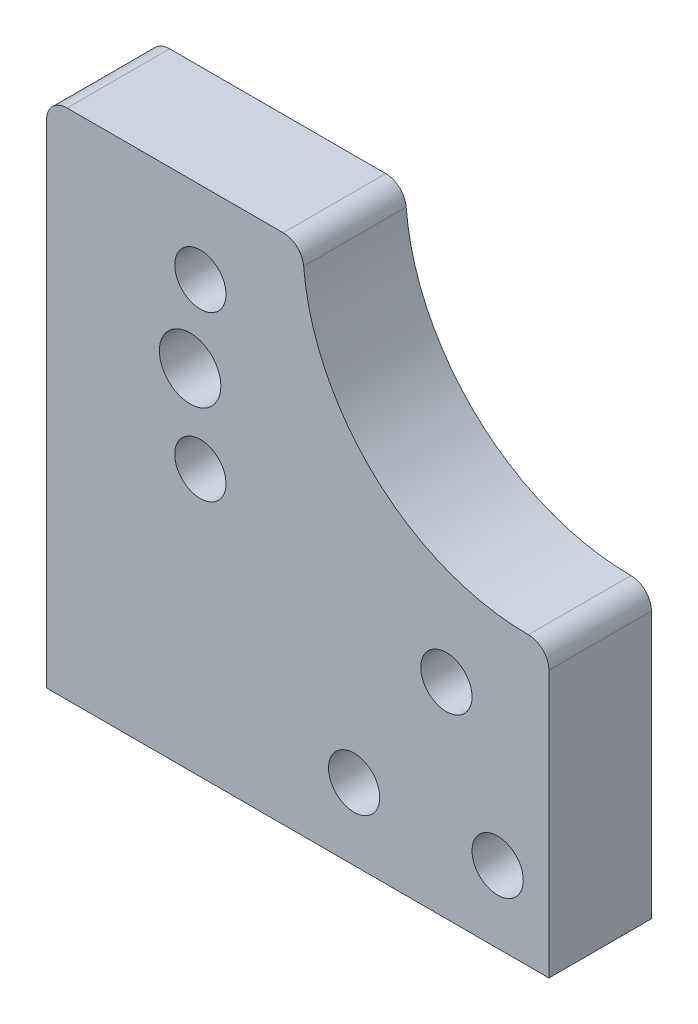
ISO-10303-21;
HEADER;
FILE_DESCRIPTION(('STEP AP214'),'2;1');
FILE_NAME('part.step','',(''),(''),'','','');
FILE_SCHEMA(('AUTOMOTIVE_DESIGN { 1 0 10303 214 1 1 1 1 }'));
ENDSEC;
DATA;
#1=APPLICATION_CONTEXT('core data for automotive mechanical design processes');
#2=APPLICATION_PROTOCOL_DEFINITION('international standard','automotive_design',2000,#1);
#3=PRODUCT_CONTEXT('',#1,'mechanical');
#4=PRODUCT('Part','Part','',(#3));
#5=PRODUCT_RELATED_PRODUCT_CATEGORY('part','',(#4));
#6=PRODUCT_DEFINITION_FORMATION('','',#4);
#7=PRODUCT_DEFINITION_CONTEXT('part definition',#1,'design');
#8=PRODUCT_DEFINITION('design','',#6,#7);
#9=PRODUCT_DEFINITION_SHAPE('','',#8);
#10=(LENGTH_UNIT() NAMED_UNIT(*) SI_UNIT(.MILLI.,.METRE.));
#11=(NAMED_UNIT(*) PLANE_ANGLE_UNIT() SI_UNIT($,.RADIAN.));
#12=(NAMED_UNIT(*) SI_UNIT($,.STERADIAN.) SOLID_ANGLE_UNIT());
#13=UNCERTAINTY_MEASURE_WITH_UNIT(LENGTH_MEASURE(1.E-05),#10,'distance_accuracy_value','');
#14=(GEOMETRIC_REPRESENTATION_CONTEXT(3) GLOBAL_UNCERTAINTY_ASSIGNED_CONTEXT((#13)) GLOBAL_UNIT_ASSIGNED_CONTEXT((#10,
#11,#12)) REPRESENTATION_CONTEXT('',''));
#15=CARTESIAN_POINT('',(0.,0.,0.));
#16=DIRECTION('',(0.,0.,1.));
#17=DIRECTION('',(1.,0.,0.));
#18=AXIS2_PLACEMENT_3D('',#15,#16,#17);
#19=CARTESIAN_POINT('',(8.99999999999999,25.,5.));
#20=DIRECTION('',(0.,0.,1.));
#21=DIRECTION('',(1.,0.,0.));
#22=AXIS2_PLACEMENT_3D('',#19,#20,#21);
#23=PLANE('',#22);
#24=CARTESIAN_POINT('',(-7.,13.,5.));
#25=DIRECTION('',(0.,0.,1.));
#26=DIRECTION('',(1.,0.,0.));
#27=AXIS2_PLACEMENT_3D('',#24,#25,#26);
#28=CIRCLE('',#27,1.25);
#29=CARTESIAN_POINT('',(-5.75,13.,5.));
#30=VERTEX_POINT('',#29);
#31=EDGE_CURVE('E134',#30,#30,#28,.T.);
#32=ORIENTED_EDGE('',*,*,#31,.F.);
#33=EDGE_LOOP('',(#32));
#34=FACE_BOUND('',#33,.T.);
#35=CARTESIAN_POINT('',(-7.,21.,5.));
#36=DIRECTION('',(0.,0.,1.));
#37=DIRECTION('',(1.,0.,0.));
#38=AXIS2_PLACEMENT_3D('',#35,#36,#37);
#39=CIRCLE('',#38,1.25);
#40=CARTESIAN_POINT('',(-5.75,21.,5.));
#41=VERTEX_POINT('',#40);
#42=EDGE_CURVE('E140',#41,#41,#39,.T.);
#43=ORIENTED_EDGE('',*,*,#42,.F.);
#44=EDGE_LOOP('',(#43));
#45=FACE_BOUND('',#44,.T.);
#46=CARTESIAN_POINT('',(5.,10.,5.));
#47=DIRECTION('',(0.,0.,1.));
#48=DIRECTION('',(1.,0.,0.));
#49=AXIS2_PLACEMENT_3D('',#46,#47,#48);
#50=CIRCLE('',#49,1.25);
#51=CARTESIAN_POINT('',(6.25,10.,5.));
#52=VERTEX_POINT('',#51);
#53=EDGE_CURVE('E146',#52,#52,#50,.T.);
#54=ORIENTED_EDGE('',*,*,#53,.F.);
#55=EDGE_LOOP('',(#54));
#56=FACE_BOUND('',#55,.T.);
#57=CARTESIAN_POINT('',(0.499999999999997,3.5,5.));
#58=DIRECTION('',(0.,0.,1.));
#59=DIRECTION('',(1.,0.,0.));
#60=AXIS2_PLACEMENT_3D('',#57,#58,#59);
#61=CIRCLE('',#60,1.25);
#62=CARTESIAN_POINT('',(1.75,3.5,5.));
#63=VERTEX_POINT('',#62);
#64=EDGE_CURVE('E152',#63,#63,#61,.T.);
#65=ORIENTED_EDGE('',*,*,#64,.F.);
#66=EDGE_LOOP('',(#65));
#67=FACE_BOUND('',#66,.T.);
#68=CARTESIAN_POINT('',(7.5,3.5,5.));
#69=DIRECTION('',(0.,0.,1.));
#70=DIRECTION('',(1.,0.,0.));
#71=AXIS2_PLACEMENT_3D('',#68,#69,#70);
#72=CIRCLE('',#71,1.25);
#73=CARTESIAN_POINT('',(8.75,3.5,5.));
#74=VERTEX_POINT('',#73);
#75=EDGE_CURVE('E158',#74,#74,#72,.T.);
#76=ORIENTED_EDGE('',*,*,#75,.F.);
#77=EDGE_LOOP('',(#76));
#78=FACE_BOUND('',#77,.T.);
#79=DIRECTION('',(-1.,0.,0.));
#80=VECTOR('',#79,1.);
#81=CARTESIAN_POINT('',(-14.5,25.,5.));
#82=LINE('',#81,#80);
#83=CARTESIAN_POINT('',(-2.9582607431014,25.,5.));
#84=VERTEX_POINT('',#83);
#85=CARTESIAN_POINT('',(-13.5,25.,5.));
#86=VERTEX_POINT('',#85);
#87=EDGE_CURVE('E171',#84,#86,#82,.T.);
#88=ORIENTED_EDGE('',*,*,#87,.T.);
#89=CARTESIAN_POINT('',(-13.5,24.,5.));
#90=DIRECTION('',(0.,0.,1.));
#91=DIRECTION('',(1.,0.,0.));
#92=AXIS2_PLACEMENT_3D('',#89,#90,#91);
#93=CIRCLE('',#92,1.);
#94=CARTESIAN_POINT('',(-14.5,24.,5.));
#95=VERTEX_POINT('',#94);
#96=EDGE_CURVE('E220',#86,#95,#93,.T.);
#97=ORIENTED_EDGE('',*,*,#96,.T.);
#98=DIRECTION('',(0.,-1.,0.));
#99=VECTOR('',#98,1.);
#100=CARTESIAN_POINT('',(-14.5,0.,5.));
#101=LINE('',#100,#99);
#102=CARTESIAN_POINT('',(-14.5,0.,5.));
#103=VERTEX_POINT('',#102);
#104=EDGE_CURVE('E174',#95,#103,#101,.T.);
#105=ORIENTED_EDGE('',*,*,#104,.T.);
#106=DIRECTION('',(1.,0.,0.));
#107=VECTOR('',#106,1.);
#108=CARTESIAN_POINT('',(-9.99999999999999,0.,5.));
#109=LINE('',#108,#107);
#110=CARTESIAN_POINT('',(9.99999999999999,0.,5.));
#111=VERTEX_POINT('',#110);
#112=EDGE_CURVE('E177',#103,#111,#109,.T.);
#113=ORIENTED_EDGE('',*,*,#112,.T.);
#114=DIRECTION('',(0.,1.,0.));
#115=VECTOR('',#114,1.);
#116=CARTESIAN_POINT('',(10.,0.499999999999998,5.));
#117=LINE('',#116,#115);
#118=CARTESIAN_POINT('',(10.0000000000002,13.,5.));
#119=VERTEX_POINT('',#118);
#120=EDGE_CURVE('E179',#111,#119,#117,.T.);
#121=ORIENTED_EDGE('',*,*,#120,.T.);
#122=CARTESIAN_POINT('',(9.,13.,5.));
#123=DIRECTION('',(0.,0.,1.));
#124=DIRECTION('',(1.,0.,0.));
#125=AXIS2_PLACEMENT_3D('',#122,#123,#124);
#126=CIRCLE('',#125,1.);
#127=CARTESIAN_POINT('',(8.99999999999998,14.,5.));
#128=VERTEX_POINT('',#127);
#129=EDGE_CURVE('E216',#119,#128,#126,.T.);
#130=ORIENTED_EDGE('',*,*,#129,.T.);
#131=CARTESIAN_POINT('',(8.99999999999999,25.,5.));
#132=DIRECTION('',(0.,0.,-1.));
#133=DIRECTION('',(1.,0.,0.));
#134=AXIS2_PLACEMENT_3D('',#131,#132,#133);
#135=CIRCLE('',#134,11.);
#136=CARTESIAN_POINT('',(-1.96173901450962,24.0833333333333,5.));
#137=VERTEX_POINT('',#136);
#138=EDGE_CURVE('E181',#128,#137,#135,.T.);
#139=ORIENTED_EDGE('',*,*,#138,.T.);
#140=CARTESIAN_POINT('',(-2.9582607431014,24.,5.));
#141=DIRECTION('',(0.,0.,1.));
#142=DIRECTION('',(1.,0.,0.));
#143=AXIS2_PLACEMENT_3D('',#140,#141,#142);
#144=CIRCLE('',#143,1.);
#145=EDGE_CURVE('E218',#137,#84,#144,.T.);
#146=ORIENTED_EDGE('',*,*,#145,.T.);
#147=EDGE_LOOP('',(#88,#97,#105,#113,#121,#130,#139,#146));
#148=FACE_BOUND('',#147,.T.);
#149=CARTESIAN_POINT('',(-7.5,17.,5.));
#150=DIRECTION('',(0.,0.,1.));
#151=DIRECTION('',(1.,0.,0.));
#152=AXIS2_PLACEMENT_3D('',#149,#150,#151);
#153=CIRCLE('',#152,1.5);
#154=CARTESIAN_POINT('',(-6.,17.,5.));
#155=VERTEX_POINT('',#154);
#156=EDGE_CURVE('E165',#155,#155,#153,.T.);
#157=ORIENTED_EDGE('',*,*,#156,.F.);
#158=EDGE_LOOP('',(#157));
#159=FACE_BOUND('',#158,.T.);
#160=ADVANCED_FACE('F43',(#34,#45,#56,#67,#78,#148,#159),#23,.T.);
#161=CARTESIAN_POINT('',(8.99999999999999,25.,0.));
#162=DIRECTION('',(0.,0.,1.));
#163=DIRECTION('',(1.,0.,0.));
#164=AXIS2_PLACEMENT_3D('',#161,#162,#163);
#165=PLANE('',#164);
#166=CARTESIAN_POINT('',(-7.,13.,0.));
#167=DIRECTION('',(0.,0.,1.));
#168=DIRECTION('',(1.,0.,0.));
#169=AXIS2_PLACEMENT_3D('',#166,#167,#168);
#170=CIRCLE('',#169,1.25);
#171=CARTESIAN_POINT('',(-5.75,13.,0.));
#172=VERTEX_POINT('',#171);
#173=EDGE_CURVE('E137',#172,#172,#170,.T.);
#174=ORIENTED_EDGE('',*,*,#173,.T.);
#175=EDGE_LOOP('',(#174));
#176=FACE_BOUND('',#175,.T.);
#177=CARTESIAN_POINT('',(-7.,21.,0.));
#178=DIRECTION('',(0.,0.,1.));
#179=DIRECTION('',(1.,0.,0.));
#180=AXIS2_PLACEMENT_3D('',#177,#178,#179);
#181=CIRCLE('',#180,1.25);
#182=CARTESIAN_POINT('',(-5.75,21.,0.));
#183=VERTEX_POINT('',#182);
#184=EDGE_CURVE('E143',#183,#183,#181,.T.);
#185=ORIENTED_EDGE('',*,*,#184,.T.);
#186=EDGE_LOOP('',(#185));
#187=FACE_BOUND('',#186,.T.);
#188=CARTESIAN_POINT('',(5.,10.,0.));
#189=DIRECTION('',(0.,0.,1.));
#190=DIRECTION('',(1.,0.,0.));
#191=AXIS2_PLACEMENT_3D('',#188,#189,#190);
#192=CIRCLE('',#191,1.25);
#193=CARTESIAN_POINT('',(6.25,10.,0.));
#194=VERTEX_POINT('',#193);
#195=EDGE_CURVE('E149',#194,#194,#192,.T.);
#196=ORIENTED_EDGE('',*,*,#195,.T.);
#197=EDGE_LOOP('',(#196));
#198=FACE_BOUND('',#197,.T.);
#199=CARTESIAN_POINT('',(0.499999999999997,3.5,0.));
#200=DIRECTION('',(0.,0.,1.));
#201=DIRECTION('',(1.,0.,0.));
#202=AXIS2_PLACEMENT_3D('',#199,#200,#201);
#203=CIRCLE('',#202,1.25);
#204=CARTESIAN_POINT('',(1.75,3.5,0.));
#205=VERTEX_POINT('',#204);
#206=EDGE_CURVE('E155',#205,#205,#203,.T.);
#207=ORIENTED_EDGE('',*,*,#206,.T.);
#208=EDGE_LOOP('',(#207));
#209=FACE_BOUND('',#208,.T.);
#210=CARTESIAN_POINT('',(7.5,3.5,0.));
#211=DIRECTION('',(0.,0.,1.));
#212=DIRECTION('',(1.,0.,0.));
#213=AXIS2_PLACEMENT_3D('',#210,#211,#212);
#214=CIRCLE('',#213,1.25);
#215=CARTESIAN_POINT('',(8.75,3.5,0.));
#216=VERTEX_POINT('',#215);
#217=EDGE_CURVE('E161',#216,#216,#214,.T.);
#218=ORIENTED_EDGE('',*,*,#217,.T.);
#219=EDGE_LOOP('',(#218));
#220=FACE_BOUND('',#219,.T.);
#221=DIRECTION('',(0.,-1.,0.));
#222=VECTOR('',#221,1.);
#223=CARTESIAN_POINT('',(-14.5,0.,0.));
#224=LINE('',#223,#222);
#225=CARTESIAN_POINT('',(-14.5,24.,0.));
#226=VERTEX_POINT('',#225);
#227=CARTESIAN_POINT('',(-14.5,0.,0.));
#228=VERTEX_POINT('',#227);
#229=EDGE_CURVE('E168',#226,#228,#224,.T.);
#230=ORIENTED_EDGE('',*,*,#229,.F.);
#231=CARTESIAN_POINT('',(-13.5,24.,0.));
#232=DIRECTION('',(0.,0.,1.));
#233=DIRECTION('',(1.,0.,0.));
#234=AXIS2_PLACEMENT_3D('',#231,#232,#233);
#235=CIRCLE('',#234,1.);
#236=CARTESIAN_POINT('',(-13.5,25.,0.));
#237=VERTEX_POINT('',#236);
#238=EDGE_CURVE('E209',#226,#237,#235,.F.);
#239=ORIENTED_EDGE('',*,*,#238,.T.);
#240=DIRECTION('',(-1.,0.,0.));
#241=VECTOR('',#240,1.);
#242=CARTESIAN_POINT('',(-10.,25.,0.));
#243=LINE('',#242,#241);
#244=CARTESIAN_POINT('',(-2.9582607431014,25.,0.));
#245=VERTEX_POINT('',#244);
#246=EDGE_CURVE('E175',#245,#237,#243,.T.);
#247=ORIENTED_EDGE('',*,*,#246,.F.);
#248=CARTESIAN_POINT('',(-2.9582607431014,24.,0.));
#249=DIRECTION('',(0.,0.,1.));
#250=DIRECTION('',(1.,0.,0.));
#251=AXIS2_PLACEMENT_3D('',#248,#249,#250);
#252=CIRCLE('',#251,1.);
#253=CARTESIAN_POINT('',(-1.96173901450962,24.0833333333333,0.));
#254=VERTEX_POINT('',#253);
#255=EDGE_CURVE('E207',#245,#254,#252,.F.);
#256=ORIENTED_EDGE('',*,*,#255,.T.);
#257=CARTESIAN_POINT('',(8.99999999999999,25.,0.));
#258=DIRECTION('',(0.,0.,-1.));
#259=DIRECTION('',(1.,0.,0.));
#260=AXIS2_PLACEMENT_3D('',#257,#258,#259);
#261=CIRCLE('',#260,11.);
#262=CARTESIAN_POINT('',(8.99999999999998,14.,0.));
#263=VERTEX_POINT('',#262);
#264=EDGE_CURVE('E190',#263,#254,#261,.T.);
#265=ORIENTED_EDGE('',*,*,#264,.F.);
#266=CARTESIAN_POINT('',(9.,13.,0.));
#267=DIRECTION('',(0.,0.,1.));
#268=DIRECTION('',(1.,0.,0.));
#269=AXIS2_PLACEMENT_3D('',#266,#267,#268);
#270=CIRCLE('',#269,1.);
#271=CARTESIAN_POINT('',(10.,13.,0.));
#272=VERTEX_POINT('',#271);
#273=EDGE_CURVE('E205',#263,#272,#270,.F.);
#274=ORIENTED_EDGE('',*,*,#273,.T.);
#275=DIRECTION('',(0.,1.,0.));
#276=VECTOR('',#275,1.);
#277=CARTESIAN_POINT('',(10.,14.,0.));
#278=LINE('',#277,#276);
#279=CARTESIAN_POINT('',(9.99999999999999,0.,0.));
#280=VERTEX_POINT('',#279);
#281=EDGE_CURVE('E188',#280,#272,#278,.T.);
#282=ORIENTED_EDGE('',*,*,#281,.F.);
#283=DIRECTION('',(1.,0.,0.));
#284=VECTOR('',#283,1.);
#285=CARTESIAN_POINT('',(9.99999999999999,0.,0.));
#286=LINE('',#285,#284);
#287=EDGE_CURVE('E185',#228,#280,#286,.T.);
#288=ORIENTED_EDGE('',*,*,#287,.F.);
#289=EDGE_LOOP('',(#230,#239,#247,#256,#265,#274,#282,#288));
#290=FACE_BOUND('',#289,.T.);
#291=CARTESIAN_POINT('',(-7.5,17.,0.));
#292=DIRECTION('',(0.,0.,1.));
#293=DIRECTION('',(1.,0.,0.));
#294=AXIS2_PLACEMENT_3D('',#291,#292,#293);
#295=CIRCLE('',#294,1.5);
#296=CARTESIAN_POINT('',(-6.,17.,0.));
#297=VERTEX_POINT('',#296);
#298=EDGE_CURVE('E164',#297,#297,#295,.T.);
#299=ORIENTED_EDGE('',*,*,#298,.T.);
#300=EDGE_LOOP('',(#299));
#301=FACE_BOUND('',#300,.T.);
#302=ADVANCED_FACE('F237',(#176,#187,#198,#209,#220,#290,#301),#165,.F.);
#303=CARTESIAN_POINT('',(-14.5,0.,5.));
#304=DIRECTION('',(1.,0.,0.));
#305=DIRECTION('',(0.,0.,-1.));
#306=AXIS2_PLACEMENT_3D('',#303,#304,#305);
#307=PLANE('',#306);
#308=ORIENTED_EDGE('',*,*,#104,.F.);
#309=DIRECTION('',(0.,0.,-1.));
#310=VECTOR('',#309,1.);
#311=CARTESIAN_POINT('',(-14.5,24.,5.));
#312=LINE('',#311,#310);
#313=EDGE_CURVE('E202',#95,#226,#312,.T.);
#314=ORIENTED_EDGE('',*,*,#313,.T.);
#315=ORIENTED_EDGE('',*,*,#229,.T.);
#316=DIRECTION('',(0.,0.,-1.));
#317=VECTOR('',#316,1.);
#318=CARTESIAN_POINT('',(-14.5,0.,5.));
#319=LINE('',#318,#317);
#320=EDGE_CURVE('E199',#103,#228,#319,.T.);
#321=ORIENTED_EDGE('',*,*,#320,.F.);
#322=EDGE_LOOP('',(#308,#314,#315,#321));
#323=FACE_BOUND('',#322,.T.);
#324=ADVANCED_FACE('F231',(#323),#307,.F.);
#325=CARTESIAN_POINT('',(9.99999999999999,0.,5.));
#326=DIRECTION('',(0.,1.,0.));
#327=DIRECTION('',(0.,0.,1.));
#328=AXIS2_PLACEMENT_3D('',#325,#326,#327);
#329=PLANE('',#328);
#330=CARTESIAN_POINT('',(-3.75,0.,2.5));
#331=DIRECTION('',(0.,-1.,0.));
#332=DIRECTION('',(0.,0.,-1.));
#333=AXIS2_PLACEMENT_3D('',#330,#331,#332);
#334=CIRCLE('',#333,1.24999999999999);
#335=CARTESIAN_POINT('',(-3.75,0.,1.25000000000001));
#336=VERTEX_POINT('',#335);
#337=EDGE_CURVE('E124',#336,#336,#334,.T.);
#338=ORIENTED_EDGE('',*,*,#337,.F.);
#339=EDGE_LOOP('',(#338));
#340=FACE_BOUND('',#339,.T.);
#341=CARTESIAN_POINT('',(-10.25,0.,2.5));
#342=DIRECTION('',(0.,-1.,0.));
#343=DIRECTION('',(0.,0.,-1.));
#344=AXIS2_PLACEMENT_3D('',#341,#342,#343);
#345=CIRCLE('',#344,1.24999999999999);
#346=CARTESIAN_POINT('',(-10.25,0.,1.25000000000001));
#347=VERTEX_POINT('',#346);
#348=EDGE_CURVE('E123',#347,#347,#345,.T.);
#349=ORIENTED_EDGE('',*,*,#348,.F.);
#350=EDGE_LOOP('',(#349));
#351=FACE_BOUND('',#350,.T.);
#352=ORIENTED_EDGE('',*,*,#287,.T.);
#353=DIRECTION('',(0.,0.,-1.));
#354=VECTOR('',#353,1.);
#355=CARTESIAN_POINT('',(9.99999999999999,0.,5.));
#356=LINE('',#355,#354);
#357=EDGE_CURVE('E196',#111,#280,#356,.T.);
#358=ORIENTED_EDGE('',*,*,#357,.F.);
#359=ORIENTED_EDGE('',*,*,#112,.F.);
#360=ORIENTED_EDGE('',*,*,#320,.T.);
#361=EDGE_LOOP('',(#352,#358,#359,#360));
#362=FACE_BOUND('',#361,.T.);
#363=ADVANCED_FACE('F254',(#340,#351,#362),#329,.F.);
#364=CARTESIAN_POINT('',(10.,14.,5.));
#365=DIRECTION('',(-1.,0.,0.));
#366=DIRECTION('',(0.,-1.,0.));
#367=AXIS2_PLACEMENT_3D('',#364,#365,#366);
#368=PLANE('',#367);
#369=ORIENTED_EDGE('',*,*,#281,.T.);
#370=DIRECTION('',(0.,0.,-1.));
#371=VECTOR('',#370,1.);
#372=CARTESIAN_POINT('',(10.,13.,5.));
#373=LINE('',#372,#371);
#374=EDGE_CURVE('E11',#272,#119,#373,.F.);
#375=ORIENTED_EDGE('',*,*,#374,.T.);
#376=ORIENTED_EDGE('',*,*,#120,.F.);
#377=ORIENTED_EDGE('',*,*,#357,.T.);
#378=EDGE_LOOP('',(#369,#375,#376,#377));
#379=FACE_BOUND('',#378,.T.);
#380=ADVANCED_FACE('F251',(#379),#368,.F.);
#381=CARTESIAN_POINT('',(8.99999999999999,25.,5.));
#382=DIRECTION('',(0.,0.,-1.));
#383=DIRECTION('',(-1.,0.,0.));
#384=AXIS2_PLACEMENT_3D('',#381,#382,#383);
#385=CYLINDRICAL_SURFACE('',#384,11.);
#386=ORIENTED_EDGE('',*,*,#264,.T.);
#387=DIRECTION('',(0.,0.,-1.));
#388=VECTOR('',#387,1.);
#389=CARTESIAN_POINT('',(-1.96173901450962,24.0833333333333,5.));
#390=LINE('',#389,#388);
#391=EDGE_CURVE('E51',#254,#137,#390,.F.);
#392=ORIENTED_EDGE('',*,*,#391,.T.);
#393=ORIENTED_EDGE('',*,*,#138,.F.);
#394=DIRECTION('',(0.,0.,-1.));
#395=VECTOR('',#394,1.);
#396=CARTESIAN_POINT('',(8.99999999999998,14.,5.));
#397=LINE('',#396,#395);
#398=EDGE_CURVE('E183',#128,#263,#397,.T.);
#399=ORIENTED_EDGE('',*,*,#398,.T.);
#400=EDGE_LOOP('',(#386,#392,#393,#399));
#401=FACE_BOUND('',#400,.T.);
#402=ADVANCED_FACE('F247',(#401),#385,.F.);
#403=CARTESIAN_POINT('',(-10.,25.,5.));
#404=DIRECTION('',(0.,-1.,0.));
#405=DIRECTION('',(1.,0.,0.));
#406=AXIS2_PLACEMENT_3D('',#403,#404,#405);
#407=PLANE('',#406);
#408=ORIENTED_EDGE('',*,*,#246,.T.);
#409=DIRECTION('',(0.,0.,-1.));
#410=VECTOR('',#409,1.);
#411=CARTESIAN_POINT('',(-13.5,25.,5.));
#412=LINE('',#411,#410);
#413=EDGE_CURVE('E214',#237,#86,#412,.F.);
#414=ORIENTED_EDGE('',*,*,#413,.T.);
#415=ORIENTED_EDGE('',*,*,#87,.F.);
#416=DIRECTION('',(0.,0.,-1.));
#417=VECTOR('',#416,1.);
#418=CARTESIAN_POINT('',(-2.9582607431014,25.,5.));
#419=LINE('',#418,#417);
#420=EDGE_CURVE('E211',#84,#245,#419,.T.);
#421=ORIENTED_EDGE('',*,*,#420,.T.);
#422=EDGE_LOOP('',(#408,#414,#415,#421));
#423=FACE_BOUND('',#422,.T.);
#424=ADVANCED_FACE('F241',(#423),#407,.F.);
#425=CARTESIAN_POINT('',(-7.5,17.,5.));
#426=DIRECTION('',(0.,0.,-1.));
#427=DIRECTION('',(-1.,0.,0.));
#428=AXIS2_PLACEMENT_3D('',#425,#426,#427);
#429=CYLINDRICAL_SURFACE('',#428,1.5);
#430=ORIENTED_EDGE('',*,*,#156,.T.);
#431=EDGE_LOOP('',(#430));
#432=FACE_BOUND('',#431,.T.);
#433=ORIENTED_EDGE('',*,*,#298,.F.);
#434=EDGE_LOOP('',(#433));
#435=FACE_BOUND('',#434,.T.);
#436=ADVANCED_FACE('F277',(#432,#435),#429,.F.);
#437=CARTESIAN_POINT('',(7.5,3.5,5.));
#438=DIRECTION('',(0.,0.,1.));
#439=DIRECTION('',(1.,0.,0.));
#440=AXIS2_PLACEMENT_3D('',#437,#438,#439);
#441=CYLINDRICAL_SURFACE('',#440,1.25);
#442=ORIENTED_EDGE('',*,*,#217,.F.);
#443=EDGE_LOOP('',(#442));
#444=FACE_BOUND('',#443,.T.);
#445=ORIENTED_EDGE('',*,*,#75,.T.);
#446=EDGE_LOOP('',(#445));
#447=FACE_BOUND('',#446,.T.);
#448=ADVANCED_FACE('F298',(#444,#447),#441,.F.);
#449=CARTESIAN_POINT('',(0.499999999999997,3.5,5.));
#450=DIRECTION('',(0.,0.,1.));
#451=DIRECTION('',(1.,0.,0.));
#452=AXIS2_PLACEMENT_3D('',#449,#450,#451);
#453=CYLINDRICAL_SURFACE('',#452,1.25);
#454=ORIENTED_EDGE('',*,*,#206,.F.);
#455=EDGE_LOOP('',(#454));
#456=FACE_BOUND('',#455,.T.);
#457=ORIENTED_EDGE('',*,*,#64,.T.);
#458=EDGE_LOOP('',(#457));
#459=FACE_BOUND('',#458,.T.);
#460=ADVANCED_FACE('F306',(#456,#459),#453,.F.);
#461=CARTESIAN_POINT('',(5.,10.,5.));
#462=DIRECTION('',(0.,0.,1.));
#463=DIRECTION('',(1.,0.,0.));
#464=AXIS2_PLACEMENT_3D('',#461,#462,#463);
#465=CYLINDRICAL_SURFACE('',#464,1.25);
#466=ORIENTED_EDGE('',*,*,#195,.F.);
#467=EDGE_LOOP('',(#466));
#468=FACE_BOUND('',#467,.T.);
#469=ORIENTED_EDGE('',*,*,#53,.T.);
#470=EDGE_LOOP('',(#469));
#471=FACE_BOUND('',#470,.T.);
#472=ADVANCED_FACE('F314',(#468,#471),#465,.F.);
#473=CARTESIAN_POINT('',(-7.,21.,5.));
#474=DIRECTION('',(0.,0.,1.));
#475=DIRECTION('',(1.,0.,0.));
#476=AXIS2_PLACEMENT_3D('',#473,#474,#475);
#477=CYLINDRICAL_SURFACE('',#476,1.25);
#478=ORIENTED_EDGE('',*,*,#184,.F.);
#479=EDGE_LOOP('',(#478));
#480=FACE_BOUND('',#479,.T.);
#481=ORIENTED_EDGE('',*,*,#42,.T.);
#482=EDGE_LOOP('',(#481));
#483=FACE_BOUND('',#482,.T.);
#484=ADVANCED_FACE('F322',(#480,#483),#477,.F.);
#485=CARTESIAN_POINT('',(-7.,13.,5.));
#486=DIRECTION('',(0.,0.,1.));
#487=DIRECTION('',(1.,0.,0.));
#488=AXIS2_PLACEMENT_3D('',#485,#486,#487);
#489=CYLINDRICAL_SURFACE('',#488,1.25);
#490=ORIENTED_EDGE('',*,*,#173,.F.);
#491=EDGE_LOOP('',(#490));
#492=FACE_BOUND('',#491,.T.);
#493=ORIENTED_EDGE('',*,*,#31,.T.);
#494=EDGE_LOOP('',(#493));
#495=FACE_BOUND('',#494,.T.);
#496=ADVANCED_FACE('F331',(#492,#495),#489,.F.);
#497=CARTESIAN_POINT('',(-10.25,4.,2.5));
#498=DIRECTION('',(0.,-1.,0.));
#499=DIRECTION('',(0.,0.,-1.));
#500=AXIS2_PLACEMENT_3D('',#497,#498,#499);
#501=CONICAL_SURFACE('',#500,1.25,1.02974425867665);
#502=CARTESIAN_POINT('',(-10.25,4.75107577378445,2.5));
#503=VERTEX_POINT('',#502);
#504=VERTEX_LOOP('',#503);
#505=FACE_BOUND('',#504,.T.);
#506=CARTESIAN_POINT('',(-10.25,4.,2.5));
#507=DIRECTION('',(0.,-1.,0.));
#508=DIRECTION('',(0.,0.,-1.));
#509=AXIS2_PLACEMENT_3D('',#506,#507,#508);
#510=CIRCLE('',#509,1.25);
#511=CARTESIAN_POINT('',(-10.25,4.,1.25));
#512=VERTEX_POINT('',#511);
#513=EDGE_CURVE('E127',#512,#512,#510,.T.);
#514=ORIENTED_EDGE('',*,*,#513,.T.);
#515=EDGE_LOOP('',(#514));
#516=FACE_BOUND('',#515,.T.);
#517=ADVANCED_FACE('F339',(#505,#516),#501,.F.);
#518=CARTESIAN_POINT('',(-10.25,0.,2.5));
#519=DIRECTION('',(0.,-1.,0.));
#520=DIRECTION('',(0.,0.,-1.));
#521=AXIS2_PLACEMENT_3D('',#518,#519,#520);
#522=CYLINDRICAL_SURFACE('',#521,1.24999999999999);
#523=ORIENTED_EDGE('',*,*,#513,.F.);
#524=EDGE_LOOP('',(#523));
#525=FACE_BOUND('',#524,.T.);
#526=ORIENTED_EDGE('',*,*,#348,.T.);
#527=EDGE_LOOP('',(#526));
#528=FACE_BOUND('',#527,.T.);
#529=ADVANCED_FACE('F117',(#525,#528),#522,.F.);
#530=CARTESIAN_POINT('',(-3.75,4.,2.5));
#531=DIRECTION('',(0.,-1.,0.));
#532=DIRECTION('',(0.,0.,-1.));
#533=AXIS2_PLACEMENT_3D('',#530,#531,#532);
#534=CONICAL_SURFACE('',#533,1.25,1.02974425867665);
#535=CARTESIAN_POINT('',(-3.75,4.75107577378445,2.5));
#536=VERTEX_POINT('',#535);
#537=VERTEX_LOOP('',#536);
#538=FACE_BOUND('',#537,.T.);
#539=CARTESIAN_POINT('',(-3.75,4.,2.5));
#540=DIRECTION('',(0.,-1.,0.));
#541=DIRECTION('',(0.,0.,-1.));
#542=AXIS2_PLACEMENT_3D('',#539,#540,#541);
#543=CIRCLE('',#542,1.25);
#544=CARTESIAN_POINT('',(-3.75,4.,1.25));
#545=VERTEX_POINT('',#544);
#546=EDGE_CURVE('E121',#545,#545,#543,.T.);
#547=ORIENTED_EDGE('',*,*,#546,.T.);
#548=EDGE_LOOP('',(#547));
#549=FACE_BOUND('',#548,.T.);
#550=ADVANCED_FACE('F113',(#538,#549),#534,.F.);
#551=CARTESIAN_POINT('',(-3.75,0.,2.5));
#552=DIRECTION('',(0.,-1.,0.));
#553=DIRECTION('',(0.,0.,-1.));
#554=AXIS2_PLACEMENT_3D('',#551,#552,#553);
#555=CYLINDRICAL_SURFACE('',#554,1.24999999999999);
#556=ORIENTED_EDGE('',*,*,#546,.F.);
#557=EDGE_LOOP('',(#556));
#558=FACE_BOUND('',#557,.T.);
#559=ORIENTED_EDGE('',*,*,#337,.T.);
#560=EDGE_LOOP('',(#559));
#561=FACE_BOUND('',#560,.T.);
#562=ADVANCED_FACE('F116',(#558,#561),#555,.F.);
#563=CARTESIAN_POINT('',(-13.5,24.,5.));
#564=DIRECTION('',(0.,0.,-1.));
#565=DIRECTION('',(-1.,0.,0.));
#566=AXIS2_PLACEMENT_3D('',#563,#564,#565);
#567=CYLINDRICAL_SURFACE('',#566,1.);
#568=ORIENTED_EDGE('',*,*,#96,.F.);
#569=ORIENTED_EDGE('',*,*,#413,.F.);
#570=ORIENTED_EDGE('',*,*,#238,.F.);
#571=ORIENTED_EDGE('',*,*,#313,.F.);
#572=EDGE_LOOP('',(#568,#569,#570,#571));
#573=FACE_BOUND('',#572,.T.);
#574=ADVANCED_FACE('F234',(#573),#567,.T.);
#575=CARTESIAN_POINT('',(-2.9582607431014,24.,5.));
#576=DIRECTION('',(0.,0.,-1.));
#577=DIRECTION('',(-1.,0.,0.));
#578=AXIS2_PLACEMENT_3D('',#575,#576,#577);
#579=CYLINDRICAL_SURFACE('',#578,1.);
#580=ORIENTED_EDGE('',*,*,#145,.F.);
#581=ORIENTED_EDGE('',*,*,#391,.F.);
#582=ORIENTED_EDGE('',*,*,#255,.F.);
#583=ORIENTED_EDGE('',*,*,#420,.F.);
#584=EDGE_LOOP('',(#580,#581,#582,#583));
#585=FACE_BOUND('',#584,.T.);
#586=ADVANCED_FACE('F245',(#585),#579,.T.);
#587=CARTESIAN_POINT('',(9.,13.,5.));
#588=DIRECTION('',(0.,0.,-1.));
#589=DIRECTION('',(-1.,0.,0.));
#590=AXIS2_PLACEMENT_3D('',#587,#588,#589);
#591=CYLINDRICAL_SURFACE('',#590,1.);
#592=ORIENTED_EDGE('',*,*,#129,.F.);
#593=ORIENTED_EDGE('',*,*,#374,.F.);
#594=ORIENTED_EDGE('',*,*,#273,.F.);
#595=ORIENTED_EDGE('',*,*,#398,.F.);
#596=EDGE_LOOP('',(#592,#593,#594,#595));
#597=FACE_BOUND('',#596,.T.);
#598=ADVANCED_FACE('F45',(#597),#591,.T.);
#599=CLOSED_SHELL('',(#160,#302,#324,#363,#380,#402,#424,#436,#448,#460,#472,#484,#496,#517,
#529,#550,#562,#574,#586,#598));
#600=MANIFOLD_SOLID_BREP('B2',#599);
#601=ADVANCED_BREP_SHAPE_REPRESENTATION('',(#18,#600),#14);
#602=SHAPE_DEFINITION_REPRESENTATION(#9,#601);
ENDSEC;
END-ISO-10303-21;
